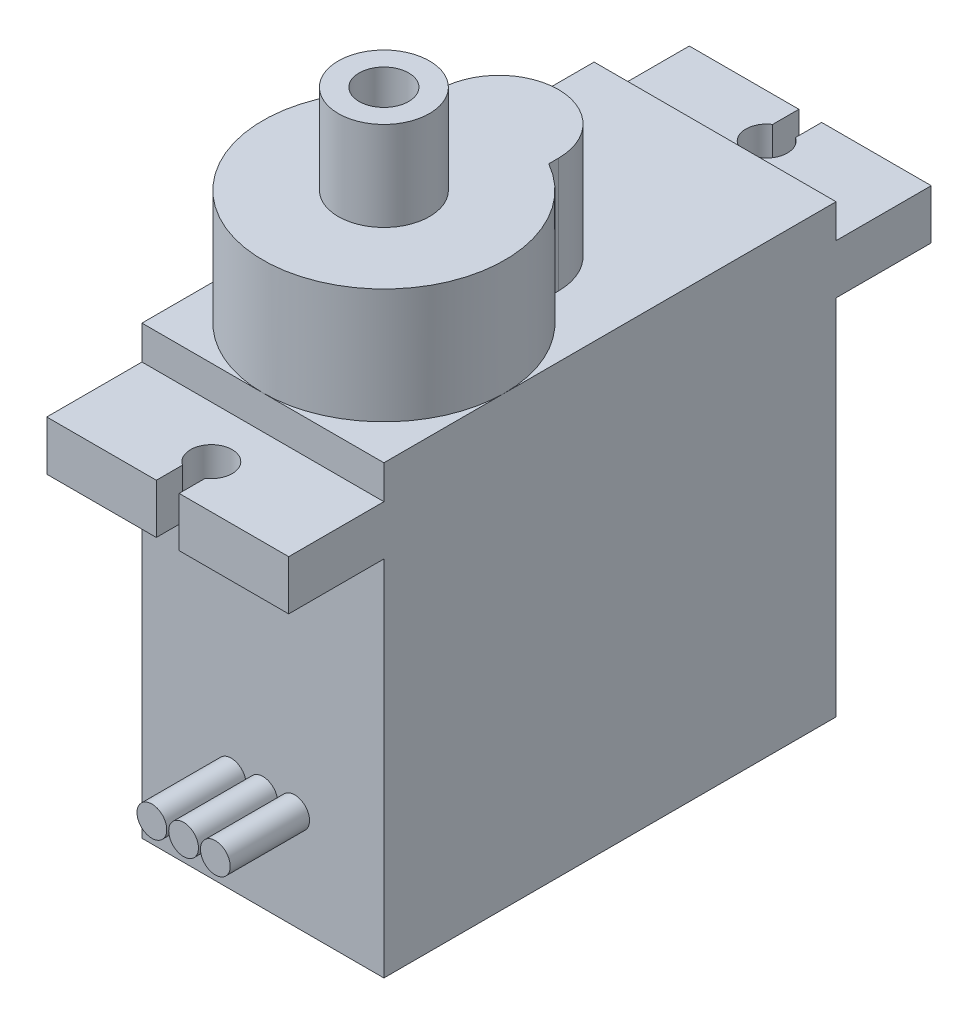
ISO-10303-21;
HEADER;
FILE_DESCRIPTION(('STEP AP214'),'2;1');
FILE_NAME('part.step','',(''),(''),'','','');
FILE_SCHEMA(('AUTOMOTIVE_DESIGN { 1 0 10303 214 1 1 1 1 }'));
ENDSEC;
DATA;
#1=APPLICATION_CONTEXT('core data for automotive mechanical design processes');
#2=APPLICATION_PROTOCOL_DEFINITION('international standard','automotive_design',2000,#1);
#3=PRODUCT_CONTEXT('',#1,'mechanical');
#4=PRODUCT('Part','Part','',(#3));
#5=PRODUCT_RELATED_PRODUCT_CATEGORY('part','',(#4));
#6=PRODUCT_DEFINITION_FORMATION('','',#4);
#7=PRODUCT_DEFINITION_CONTEXT('part definition',#1,'design');
#8=PRODUCT_DEFINITION('design','',#6,#7);
#9=PRODUCT_DEFINITION_SHAPE('','',#8);
#10=(LENGTH_UNIT() NAMED_UNIT(*) SI_UNIT(.MILLI.,.METRE.));
#11=(NAMED_UNIT(*) PLANE_ANGLE_UNIT() SI_UNIT($,.RADIAN.));
#12=(NAMED_UNIT(*) SI_UNIT($,.STERADIAN.) SOLID_ANGLE_UNIT());
#13=UNCERTAINTY_MEASURE_WITH_UNIT(LENGTH_MEASURE(1.E-05),#10,'distance_accuracy_value','');
#14=(GEOMETRIC_REPRESENTATION_CONTEXT(3) GLOBAL_UNCERTAINTY_ASSIGNED_CONTEXT((#13)) GLOBAL_UNIT_ASSIGNED_CONTEXT((#10,
#11,#12)) REPRESENTATION_CONTEXT('',''));
#15=CARTESIAN_POINT('',(0.,0.,0.));
#16=DIRECTION('',(0.,0.,1.));
#17=DIRECTION('',(1.,0.,0.));
#18=AXIS2_PLACEMENT_3D('',#15,#16,#17);
#19=CARTESIAN_POINT('',(12.2,9.55,-16.2));
#20=DIRECTION('',(0.,0.,1.));
#21=DIRECTION('',(1.,0.,0.));
#22=AXIS2_PLACEMENT_3D('',#19,#20,#21);
#23=PLANE('',#22);
#24=DIRECTION('',(-1.,0.,0.));
#25=VECTOR('',#24,1.);
#26=CARTESIAN_POINT('',(12.2,9.55,-16.2));
#27=LINE('',#26,#25);
#28=CARTESIAN_POINT('',(5.525,9.55,-16.2));
#29=VERTEX_POINT('',#28);
#30=CARTESIAN_POINT('',(0.,9.55,-16.2));
#31=VERTEX_POINT('',#30);
#32=EDGE_CURVE('E393',#29,#31,#27,.T.);
#33=ORIENTED_EDGE('',*,*,#32,.F.);
#34=DIRECTION('',(0.,1.,0.));
#35=VECTOR('',#34,1.);
#36=CARTESIAN_POINT('',(5.525,-11.25,-16.2));
#37=LINE('',#36,#35);
#38=CARTESIAN_POINT('',(5.525,7.05,-16.2));
#39=VERTEX_POINT('',#38);
#40=EDGE_CURVE('E262',#39,#29,#37,.T.);
#41=ORIENTED_EDGE('',*,*,#40,.F.);
#42=DIRECTION('',(-1.,0.,0.));
#43=VECTOR('',#42,1.);
#44=CARTESIAN_POINT('',(12.2,7.05,-16.2));
#45=LINE('',#44,#43);
#46=CARTESIAN_POINT('',(0.,7.05,-16.2));
#47=VERTEX_POINT('',#46);
#48=EDGE_CURVE('E397',#39,#47,#45,.T.);
#49=ORIENTED_EDGE('',*,*,#48,.T.);
#50=DIRECTION('',(0.,1.,0.));
#51=VECTOR('',#50,1.);
#52=CARTESIAN_POINT('',(0.,9.55,-16.2));
#53=LINE('',#52,#51);
#54=EDGE_CURVE('E346',#47,#31,#53,.T.);
#55=ORIENTED_EDGE('',*,*,#54,.T.);
#56=EDGE_LOOP('',(#33,#41,#49,#55));
#57=FACE_BOUND('',#56,.T.);
#58=ADVANCED_FACE('F37',(#57),#23,.F.);
#59=CARTESIAN_POINT('',(12.2,7.05,16.2));
#60=DIRECTION('',(0.,0.,-1.));
#61=DIRECTION('',(-1.,0.,0.));
#62=AXIS2_PLACEMENT_3D('',#59,#60,#61);
#63=PLANE('',#62);
#64=DIRECTION('',(-1.,0.,0.));
#65=VECTOR('',#64,1.);
#66=CARTESIAN_POINT('',(12.2,9.55,16.2));
#67=LINE('',#66,#65);
#68=CARTESIAN_POINT('',(12.2,9.55,16.2));
#69=VERTEX_POINT('',#68);
#70=CARTESIAN_POINT('',(6.675,9.55,16.2));
#71=VERTEX_POINT('',#70);
#72=EDGE_CURVE('E378',#69,#71,#67,.T.);
#73=ORIENTED_EDGE('',*,*,#72,.T.);
#74=DIRECTION('',(0.,1.,0.));
#75=VECTOR('',#74,1.);
#76=CARTESIAN_POINT('',(6.675,-11.25,16.2));
#77=LINE('',#76,#75);
#78=CARTESIAN_POINT('',(6.675,7.05,16.2));
#79=VERTEX_POINT('',#78);
#80=EDGE_CURVE('E250',#79,#71,#77,.T.);
#81=ORIENTED_EDGE('',*,*,#80,.F.);
#82=DIRECTION('',(-1.,0.,0.));
#83=VECTOR('',#82,1.);
#84=CARTESIAN_POINT('',(12.2,7.05,16.2));
#85=LINE('',#84,#83);
#86=CARTESIAN_POINT('',(12.2,7.05,16.2));
#87=VERTEX_POINT('',#86);
#88=EDGE_CURVE('E374',#87,#79,#85,.T.);
#89=ORIENTED_EDGE('',*,*,#88,.F.);
#90=DIRECTION('',(0.,-1.,0.));
#91=VECTOR('',#90,1.);
#92=CARTESIAN_POINT('',(12.2,7.05,16.2));
#93=LINE('',#92,#91);
#94=EDGE_CURVE('E332',#69,#87,#93,.T.);
#95=ORIENTED_EDGE('',*,*,#94,.F.);
#96=EDGE_LOOP('',(#73,#81,#89,#95));
#97=FACE_BOUND('',#96,.T.);
#98=ADVANCED_FACE('F527',(#97),#63,.F.);
#99=CARTESIAN_POINT('',(12.2,11.25,11.4));
#100=DIRECTION('',(0.,-1.,0.));
#101=DIRECTION('',(0.,0.,-1.));
#102=AXIS2_PLACEMENT_3D('',#99,#100,#101);
#103=PLANE('',#102);
#104=DIRECTION('',(0.,0.,1.));
#105=VECTOR('',#104,1.);
#106=CARTESIAN_POINT('',(3.1,11.25,-0.500000000000002));
#107=LINE('',#106,#105);
#108=CARTESIAN_POINT('',(3.1,11.25,-0.500000000000002));
#109=VERTEX_POINT('',#108);
#110=CARTESIAN_POINT('',(3.1,11.25,-0.0113086899558024));
#111=VERTEX_POINT('',#110);
#112=EDGE_CURVE('E282',#109,#111,#107,.T.);
#113=ORIENTED_EDGE('',*,*,#112,.F.);
#114=CARTESIAN_POINT('',(6.1,11.25,-0.500000000000002));
#115=DIRECTION('',(0.,1.,0.));
#116=DIRECTION('',(0.,0.,-1.));
#117=AXIS2_PLACEMENT_3D('',#114,#115,#116);
#118=CIRCLE('',#117,3.);
#119=CARTESIAN_POINT('',(9.1,11.25,-0.500000000000003));
#120=VERTEX_POINT('',#119);
#121=EDGE_CURVE('E286',#120,#109,#118,.T.);
#122=ORIENTED_EDGE('',*,*,#121,.F.);
#123=DIRECTION('',(0.,0.,-1.));
#124=VECTOR('',#123,1.);
#125=CARTESIAN_POINT('',(9.1,11.25,-0.500000000000003));
#126=LINE('',#125,#124);
#127=CARTESIAN_POINT('',(9.1,11.25,-0.0113086899557993));
#128=VERTEX_POINT('',#127);
#129=EDGE_CURVE('E277',#128,#120,#126,.T.);
#130=ORIENTED_EDGE('',*,*,#129,.F.);
#131=CARTESIAN_POINT('',(6.1,11.25,5.3));
#132=DIRECTION('',(0.,1.,0.));
#133=DIRECTION('',(0.,0.,1.));
#134=AXIS2_PLACEMENT_3D('',#131,#132,#133);
#135=CIRCLE('',#134,6.1);
#136=CARTESIAN_POINT('',(12.2,11.25,5.3));
#137=VERTEX_POINT('',#136);
#138=EDGE_CURVE('E410',#137,#128,#135,.T.);
#139=ORIENTED_EDGE('',*,*,#138,.F.);
#140=DIRECTION('',(0.,0.,1.));
#141=VECTOR('',#140,1.);
#142=CARTESIAN_POINT('',(12.2,11.25,11.4));
#143=LINE('',#142,#141);
#144=CARTESIAN_POINT('',(12.2,11.25,-11.4));
#145=VERTEX_POINT('',#144);
#146=EDGE_CURVE('E325',#145,#137,#143,.T.);
#147=ORIENTED_EDGE('',*,*,#146,.F.);
#148=DIRECTION('',(-1.,0.,0.));
#149=VECTOR('',#148,1.);
#150=CARTESIAN_POINT('',(12.2,11.25,-11.4));
#151=LINE('',#150,#149);
#152=CARTESIAN_POINT('',(0.,11.25,-11.4));
#153=VERTEX_POINT('',#152);
#154=EDGE_CURVE('E387',#145,#153,#151,.T.);
#155=ORIENTED_EDGE('',*,*,#154,.T.);
#156=DIRECTION('',(0.,0.,1.));
#157=VECTOR('',#156,1.);
#158=CARTESIAN_POINT('',(0.,11.25,11.4));
#159=LINE('',#158,#157);
#160=CARTESIAN_POINT('',(0.,11.25,5.3));
#161=VERTEX_POINT('',#160);
#162=EDGE_CURVE('E354',#153,#161,#159,.T.);
#163=ORIENTED_EDGE('',*,*,#162,.T.);
#164=EDGE_CURVE('E308',#111,#161,#135,.T.);
#165=ORIENTED_EDGE('',*,*,#164,.F.);
#166=EDGE_LOOP('',(#113,#122,#130,#139,#147,#155,#163,#165));
#167=FACE_BOUND('',#166,.T.);
#168=ADVANCED_FACE('F485',(#167),#103,.F.);
#169=CARTESIAN_POINT('',(6.1,17.05,5.3));
#170=DIRECTION('',(0.,-1.,0.));
#171=DIRECTION('',(0.,0.,-1.));
#172=AXIS2_PLACEMENT_3D('',#169,#170,#171);
#173=CYLINDRICAL_SURFACE('',#172,6.1);
#174=DIRECTION('',(0.,-1.,0.));
#175=VECTOR('',#174,1.);
#176=CARTESIAN_POINT('',(3.1,23.9905307474845,-0.0113086899558024));
#177=LINE('',#176,#175);
#178=CARTESIAN_POINT('',(3.1,17.05,-0.0113086899558024));
#179=VERTEX_POINT('',#178);
#180=EDGE_CURVE('E284',#179,#111,#177,.T.);
#181=ORIENTED_EDGE('',*,*,#180,.T.);
#182=ORIENTED_EDGE('',*,*,#164,.T.);
#183=CARTESIAN_POINT('',(6.1,11.25,11.4));
#184=VERTEX_POINT('',#183);
#185=EDGE_CURVE('E309',#161,#184,#135,.T.);
#186=ORIENTED_EDGE('',*,*,#185,.T.);
#187=EDGE_CURVE('E291',#184,#137,#135,.T.);
#188=ORIENTED_EDGE('',*,*,#187,.T.);
#189=ORIENTED_EDGE('',*,*,#138,.T.);
#190=DIRECTION('',(0.,-1.,0.));
#191=VECTOR('',#190,1.);
#192=CARTESIAN_POINT('',(9.1,23.9905307474845,-0.0113086899557993));
#193=LINE('',#192,#191);
#194=CARTESIAN_POINT('',(9.1,17.05,-0.0113086899557993));
#195=VERTEX_POINT('',#194);
#196=EDGE_CURVE('E281',#195,#128,#193,.T.);
#197=ORIENTED_EDGE('',*,*,#196,.F.);
#198=CARTESIAN_POINT('',(6.1,17.05,5.3));
#199=DIRECTION('',(0.,1.,0.));
#200=DIRECTION('',(0.,0.,1.));
#201=AXIS2_PLACEMENT_3D('',#198,#199,#200);
#202=CIRCLE('',#201,6.1);
#203=EDGE_CURVE('E302',#179,#195,#202,.T.);
#204=ORIENTED_EDGE('',*,*,#203,.F.);
#205=EDGE_LOOP('',(#181,#182,#186,#188,#189,#197,#204));
#206=FACE_BOUND('',#205,.T.);
#207=ADVANCED_FACE('F551',(#206),#173,.T.);
#208=ORIENTED_EDGE('',*,*,#187,.F.);
#209=DIRECTION('',(-1.,0.,0.));
#210=VECTOR('',#209,1.);
#211=CARTESIAN_POINT('',(12.2,11.25,11.4));
#212=LINE('',#211,#210);
#213=CARTESIAN_POINT('',(12.2,11.25,11.4));
#214=VERTEX_POINT('',#213);
#215=EDGE_CURVE('E385',#214,#184,#212,.T.);
#216=ORIENTED_EDGE('',*,*,#215,.F.);
#217=EDGE_CURVE('E324',#137,#214,#143,.T.);
#218=ORIENTED_EDGE('',*,*,#217,.F.);
#219=EDGE_LOOP('',(#208,#216,#218));
#220=FACE_BOUND('',#219,.T.);
#221=ADVANCED_FACE('F547',(#220),#103,.F.);
#222=CARTESIAN_POINT('',(12.2,-11.25,-11.4));
#223=DIRECTION('',(0.,1.,0.));
#224=DIRECTION('',(0.,0.,1.));
#225=AXIS2_PLACEMENT_3D('',#222,#223,#224);
#226=PLANE('',#225);
#227=DIRECTION('',(0.,0.,-1.));
#228=VECTOR('',#227,1.);
#229=CARTESIAN_POINT('',(0.,-11.25,-11.4));
#230=LINE('',#229,#228);
#231=CARTESIAN_POINT('',(0.,-11.25,11.4));
#232=VERTEX_POINT('',#231);
#233=CARTESIAN_POINT('',(0.,-11.25,-11.4));
#234=VERTEX_POINT('',#233);
#235=EDGE_CURVE('E305',#232,#234,#230,.T.);
#236=ORIENTED_EDGE('',*,*,#235,.T.);
#237=DIRECTION('',(-1.,0.,0.));
#238=VECTOR('',#237,1.);
#239=CARTESIAN_POINT('',(12.2,-11.25,-11.4));
#240=LINE('',#239,#238);
#241=CARTESIAN_POINT('',(12.2,-11.25,-11.4));
#242=VERTEX_POINT('',#241);
#243=EDGE_CURVE('E404',#242,#234,#240,.T.);
#244=ORIENTED_EDGE('',*,*,#243,.F.);
#245=DIRECTION('',(0.,0.,-1.));
#246=VECTOR('',#245,1.);
#247=CARTESIAN_POINT('',(12.2,-11.25,-11.4));
#248=LINE('',#247,#246);
#249=CARTESIAN_POINT('',(12.2,-11.25,11.4));
#250=VERTEX_POINT('',#249);
#251=EDGE_CURVE('E310',#250,#242,#248,.T.);
#252=ORIENTED_EDGE('',*,*,#251,.F.);
#253=DIRECTION('',(-1.,0.,0.));
#254=VECTOR('',#253,1.);
#255=CARTESIAN_POINT('',(12.2,-11.25,11.4));
#256=LINE('',#255,#254);
#257=EDGE_CURVE('E338',#250,#232,#256,.T.);
#258=ORIENTED_EDGE('',*,*,#257,.T.);
#259=EDGE_LOOP('',(#236,#244,#252,#258));
#260=FACE_BOUND('',#259,.T.);
#261=ADVANCED_FACE('F39',(#260),#226,.F.);
#262=CARTESIAN_POINT('',(12.2,7.05,-11.4));
#263=DIRECTION('',(0.,0.,1.));
#264=DIRECTION('',(1.,0.,0.));
#265=AXIS2_PLACEMENT_3D('',#262,#263,#264);
#266=PLANE('',#265);
#267=DIRECTION('',(0.,1.,0.));
#268=VECTOR('',#267,1.);
#269=CARTESIAN_POINT('',(0.,7.05,-11.4));
#270=LINE('',#269,#268);
#271=CARTESIAN_POINT('',(0.,7.05,-11.4));
#272=VERTEX_POINT('',#271);
#273=EDGE_CURVE('E341',#234,#272,#270,.T.);
#274=ORIENTED_EDGE('',*,*,#273,.T.);
#275=DIRECTION('',(-1.,0.,0.));
#276=VECTOR('',#275,1.);
#277=CARTESIAN_POINT('',(12.2,7.05,-11.4));
#278=LINE('',#277,#276);
#279=CARTESIAN_POINT('',(12.2,7.05,-11.4));
#280=VERTEX_POINT('',#279);
#281=EDGE_CURVE('E401',#280,#272,#278,.T.);
#282=ORIENTED_EDGE('',*,*,#281,.F.);
#283=DIRECTION('',(0.,1.,0.));
#284=VECTOR('',#283,1.);
#285=CARTESIAN_POINT('',(12.2,7.05,-11.4));
#286=LINE('',#285,#284);
#287=EDGE_CURVE('E313',#242,#280,#286,.T.);
#288=ORIENTED_EDGE('',*,*,#287,.F.);
#289=ORIENTED_EDGE('',*,*,#243,.T.);
#290=EDGE_LOOP('',(#274,#282,#288,#289));
#291=FACE_BOUND('',#290,.T.);
#292=ADVANCED_FACE('F451',(#291),#266,.F.);
#293=CARTESIAN_POINT('',(12.2,7.05,-16.2));
#294=DIRECTION('',(0.,1.,0.));
#295=DIRECTION('',(0.,0.,1.));
#296=AXIS2_PLACEMENT_3D('',#293,#294,#295);
#297=PLANE('',#296);
#298=ORIENTED_EDGE('',*,*,#48,.F.);
#299=DIRECTION('',(0.,0.,1.));
#300=VECTOR('',#299,1.);
#301=CARTESIAN_POINT('',(5.525,7.05,-16.2));
#302=LINE('',#301,#300);
#303=CARTESIAN_POINT('',(5.52499999999999,7.05,-14.8785641695403));
#304=VERTEX_POINT('',#303);
#305=EDGE_CURVE('E270',#39,#304,#302,.T.);
#306=ORIENTED_EDGE('',*,*,#305,.T.);
#307=CARTESIAN_POINT('',(6.1,7.05,-14.));
#308=DIRECTION('',(0.,1.,0.));
#309=DIRECTION('',(0.,0.,1.));
#310=AXIS2_PLACEMENT_3D('',#307,#308,#309);
#311=CIRCLE('',#310,1.05);
#312=CARTESIAN_POINT('',(6.67500000000001,7.05,-14.8785641695403));
#313=VERTEX_POINT('',#312);
#314=EDGE_CURVE('E273',#304,#313,#311,.T.);
#315=ORIENTED_EDGE('',*,*,#314,.T.);
#316=DIRECTION('',(0.,0.,-1.));
#317=VECTOR('',#316,1.);
#318=CARTESIAN_POINT('',(6.675,7.05,-16.2));
#319=LINE('',#318,#317);
#320=CARTESIAN_POINT('',(6.675,7.05,-16.2));
#321=VERTEX_POINT('',#320);
#322=EDGE_CURVE('E249',#313,#321,#319,.T.);
#323=ORIENTED_EDGE('',*,*,#322,.T.);
#324=CARTESIAN_POINT('',(12.2,7.05,-16.2));
#325=VERTEX_POINT('',#324);
#326=EDGE_CURVE('E398',#325,#321,#45,.T.);
#327=ORIENTED_EDGE('',*,*,#326,.F.);
#328=DIRECTION('',(0.,0.,-1.));
#329=VECTOR('',#328,1.);
#330=CARTESIAN_POINT('',(12.2,7.05,-16.2));
#331=LINE('',#330,#329);
#332=EDGE_CURVE('E316',#280,#325,#331,.T.);
#333=ORIENTED_EDGE('',*,*,#332,.F.);
#334=ORIENTED_EDGE('',*,*,#281,.T.);
#335=DIRECTION('',(0.,0.,-1.));
#336=VECTOR('',#335,1.);
#337=CARTESIAN_POINT('',(0.,7.05,-16.2));
#338=LINE('',#337,#336);
#339=EDGE_CURVE('E343',#272,#47,#338,.T.);
#340=ORIENTED_EDGE('',*,*,#339,.T.);
#341=EDGE_LOOP('',(#298,#306,#315,#323,#327,#333,#334,#340));
#342=FACE_BOUND('',#341,.T.);
#343=ADVANCED_FACE('F502',(#342),#297,.F.);
#344=ORIENTED_EDGE('',*,*,#326,.T.);
#345=DIRECTION('',(0.,1.,0.));
#346=VECTOR('',#345,1.);
#347=CARTESIAN_POINT('',(6.675,-11.25,-16.2));
#348=LINE('',#347,#346);
#349=CARTESIAN_POINT('',(6.675,9.55,-16.2));
#350=VERTEX_POINT('',#349);
#351=EDGE_CURVE('E264',#321,#350,#348,.T.);
#352=ORIENTED_EDGE('',*,*,#351,.T.);
#353=CARTESIAN_POINT('',(12.2,9.55,-16.2));
#354=VERTEX_POINT('',#353);
#355=EDGE_CURVE('E394',#354,#350,#27,.T.);
#356=ORIENTED_EDGE('',*,*,#355,.F.);
#357=DIRECTION('',(0.,1.,0.));
#358=VECTOR('',#357,1.);
#359=CARTESIAN_POINT('',(12.2,9.55,-16.2));
#360=LINE('',#359,#358);
#361=EDGE_CURVE('E318',#325,#354,#360,.T.);
#362=ORIENTED_EDGE('',*,*,#361,.F.);
#363=EDGE_LOOP('',(#344,#352,#356,#362));
#364=FACE_BOUND('',#363,.T.);
#365=ADVANCED_FACE('F507',(#364),#23,.F.);
#366=CARTESIAN_POINT('',(12.2,9.55,-11.4));
#367=DIRECTION('',(0.,-1.,0.));
#368=DIRECTION('',(0.,0.,-1.));
#369=AXIS2_PLACEMENT_3D('',#366,#367,#368);
#370=PLANE('',#369);
#371=CARTESIAN_POINT('',(6.1,9.55,-14.));
#372=DIRECTION('',(0.,1.,0.));
#373=DIRECTION('',(0.,0.,1.));
#374=AXIS2_PLACEMENT_3D('',#371,#372,#373);
#375=CIRCLE('',#374,1.05);
#376=CARTESIAN_POINT('',(5.52499999999999,9.55,-14.8785641695403));
#377=VERTEX_POINT('',#376);
#378=CARTESIAN_POINT('',(6.67500000000001,9.55,-14.8785641695403));
#379=VERTEX_POINT('',#378);
#380=EDGE_CURVE('E53',#377,#379,#375,.T.);
#381=ORIENTED_EDGE('',*,*,#380,.F.);
#382=DIRECTION('',(0.,0.,1.));
#383=VECTOR('',#382,1.);
#384=CARTESIAN_POINT('',(5.52499999999999,9.55,-14.8785641695403));
#385=LINE('',#384,#383);
#386=EDGE_CURVE('E257',#29,#377,#385,.T.);
#387=ORIENTED_EDGE('',*,*,#386,.F.);
#388=ORIENTED_EDGE('',*,*,#32,.T.);
#389=DIRECTION('',(0.,0.,1.));
#390=VECTOR('',#389,1.);
#391=CARTESIAN_POINT('',(0.,9.55,-11.4));
#392=LINE('',#391,#390);
#393=CARTESIAN_POINT('',(0.,9.55,-11.4));
#394=VERTEX_POINT('',#393);
#395=EDGE_CURVE('E349',#31,#394,#392,.T.);
#396=ORIENTED_EDGE('',*,*,#395,.T.);
#397=DIRECTION('',(-1.,0.,0.));
#398=VECTOR('',#397,1.);
#399=CARTESIAN_POINT('',(12.2,9.55,-11.4));
#400=LINE('',#399,#398);
#401=CARTESIAN_POINT('',(12.2,9.55,-11.4));
#402=VERTEX_POINT('',#401);
#403=EDGE_CURVE('E390',#402,#394,#400,.T.);
#404=ORIENTED_EDGE('',*,*,#403,.F.);
#405=DIRECTION('',(0.,0.,1.));
#406=VECTOR('',#405,1.);
#407=CARTESIAN_POINT('',(12.2,9.55,-11.4));
#408=LINE('',#407,#406);
#409=EDGE_CURVE('E320',#354,#402,#408,.T.);
#410=ORIENTED_EDGE('',*,*,#409,.F.);
#411=ORIENTED_EDGE('',*,*,#355,.T.);
#412=DIRECTION('',(0.,0.,-1.));
#413=VECTOR('',#412,1.);
#414=CARTESIAN_POINT('',(6.67500000000001,9.55,-14.8785641695403));
#415=LINE('',#414,#413);
#416=EDGE_CURVE('E255',#379,#350,#415,.T.);
#417=ORIENTED_EDGE('',*,*,#416,.F.);
#418=EDGE_LOOP('',(#381,#387,#388,#396,#404,#410,#411,#417));
#419=FACE_BOUND('',#418,.T.);
#420=ADVANCED_FACE('F494',(#419),#370,.F.);
#421=CARTESIAN_POINT('',(12.2,11.25,-11.4));
#422=DIRECTION('',(0.,0.,1.));
#423=DIRECTION('',(1.,0.,0.));
#424=AXIS2_PLACEMENT_3D('',#421,#422,#423);
#425=PLANE('',#424);
#426=DIRECTION('',(0.,1.,0.));
#427=VECTOR('',#426,1.);
#428=CARTESIAN_POINT('',(0.,11.25,-11.4));
#429=LINE('',#428,#427);
#430=EDGE_CURVE('E351',#394,#153,#429,.T.);
#431=ORIENTED_EDGE('',*,*,#430,.T.);
#432=ORIENTED_EDGE('',*,*,#154,.F.);
#433=DIRECTION('',(0.,1.,0.));
#434=VECTOR('',#433,1.);
#435=CARTESIAN_POINT('',(12.2,11.25,-11.4));
#436=LINE('',#435,#434);
#437=EDGE_CURVE('E322',#402,#145,#436,.T.);
#438=ORIENTED_EDGE('',*,*,#437,.F.);
#439=ORIENTED_EDGE('',*,*,#403,.T.);
#440=EDGE_LOOP('',(#431,#432,#438,#439));
#441=FACE_BOUND('',#440,.T.);
#442=ADVANCED_FACE('F490',(#441),#425,.F.);
#443=ORIENTED_EDGE('',*,*,#185,.F.);
#444=CARTESIAN_POINT('',(0.,11.25,11.4));
#445=VERTEX_POINT('',#444);
#446=EDGE_CURVE('E353',#161,#445,#159,.T.);
#447=ORIENTED_EDGE('',*,*,#446,.T.);
#448=EDGE_CURVE('E384',#184,#445,#212,.T.);
#449=ORIENTED_EDGE('',*,*,#448,.F.);
#450=EDGE_LOOP('',(#443,#447,#449));
#451=FACE_BOUND('',#450,.T.);
#452=ADVANCED_FACE('F554',(#451),#103,.F.);
#453=CARTESIAN_POINT('',(12.2,9.55,11.4));
#454=DIRECTION('',(0.,0.,-1.));
#455=DIRECTION('',(-1.,0.,0.));
#456=AXIS2_PLACEMENT_3D('',#453,#454,#455);
#457=PLANE('',#456);
#458=DIRECTION('',(0.,-1.,0.));
#459=VECTOR('',#458,1.);
#460=CARTESIAN_POINT('',(0.,9.55,11.4));
#461=LINE('',#460,#459);
#462=CARTESIAN_POINT('',(0.,9.55,11.4));
#463=VERTEX_POINT('',#462);
#464=EDGE_CURVE('E357',#445,#463,#461,.T.);
#465=ORIENTED_EDGE('',*,*,#464,.T.);
#466=DIRECTION('',(-1.,0.,0.));
#467=VECTOR('',#466,1.);
#468=CARTESIAN_POINT('',(12.2,9.55,11.4));
#469=LINE('',#468,#467);
#470=CARTESIAN_POINT('',(12.2,9.55,11.4));
#471=VERTEX_POINT('',#470);
#472=EDGE_CURVE('E381',#471,#463,#469,.T.);
#473=ORIENTED_EDGE('',*,*,#472,.F.);
#474=DIRECTION('',(0.,-1.,0.));
#475=VECTOR('',#474,1.);
#476=CARTESIAN_POINT('',(12.2,9.55,11.4));
#477=LINE('',#476,#475);
#478=EDGE_CURVE('E328',#214,#471,#477,.T.);
#479=ORIENTED_EDGE('',*,*,#478,.F.);
#480=ORIENTED_EDGE('',*,*,#215,.T.);
#481=ORIENTED_EDGE('',*,*,#448,.T.);
#482=EDGE_LOOP('',(#465,#473,#479,#480,#481));
#483=FACE_BOUND('',#482,.T.);
#484=ADVANCED_FACE('F474',(#483),#457,.F.);
#485=CARTESIAN_POINT('',(12.2,9.55,16.2));
#486=DIRECTION('',(0.,-1.,0.));
#487=DIRECTION('',(0.,0.,-1.));
#488=AXIS2_PLACEMENT_3D('',#485,#486,#487);
#489=PLANE('',#488);
#490=CARTESIAN_POINT('',(6.10000000000001,9.55,14.));
#491=DIRECTION('',(0.,1.,0.));
#492=DIRECTION('',(0.,0.,-1.));
#493=AXIS2_PLACEMENT_3D('',#490,#491,#492);
#494=CIRCLE('',#493,1.05);
#495=CARTESIAN_POINT('',(6.67500000000001,9.55,14.8785641695403));
#496=VERTEX_POINT('',#495);
#497=CARTESIAN_POINT('',(5.525,9.55,14.8785641695403));
#498=VERTEX_POINT('',#497);
#499=EDGE_CURVE('E237',#496,#498,#494,.T.);
#500=ORIENTED_EDGE('',*,*,#499,.F.);
#501=DIRECTION('',(0.,0.,-1.));
#502=VECTOR('',#501,1.);
#503=CARTESIAN_POINT('',(6.67500000000001,9.55,14.8785641695403));
#504=LINE('',#503,#502);
#505=EDGE_CURVE('E243',#71,#496,#504,.T.);
#506=ORIENTED_EDGE('',*,*,#505,.F.);
#507=ORIENTED_EDGE('',*,*,#72,.F.);
#508=DIRECTION('',(0.,0.,1.));
#509=VECTOR('',#508,1.);
#510=CARTESIAN_POINT('',(12.2,9.55,16.2));
#511=LINE('',#510,#509);
#512=EDGE_CURVE('E330',#471,#69,#511,.T.);
#513=ORIENTED_EDGE('',*,*,#512,.F.);
#514=ORIENTED_EDGE('',*,*,#472,.T.);
#515=DIRECTION('',(0.,0.,1.));
#516=VECTOR('',#515,1.);
#517=CARTESIAN_POINT('',(0.,9.55,16.2));
#518=LINE('',#517,#516);
#519=CARTESIAN_POINT('',(0.,9.55,16.2));
#520=VERTEX_POINT('',#519);
#521=EDGE_CURVE('E359',#463,#520,#518,.T.);
#522=ORIENTED_EDGE('',*,*,#521,.T.);
#523=CARTESIAN_POINT('',(5.525,9.55,16.2));
#524=VERTEX_POINT('',#523);
#525=EDGE_CURVE('E377',#524,#520,#67,.T.);
#526=ORIENTED_EDGE('',*,*,#525,.F.);
#527=DIRECTION('',(0.,0.,1.));
#528=VECTOR('',#527,1.);
#529=CARTESIAN_POINT('',(5.525,9.55,14.8785641695403));
#530=LINE('',#529,#528);
#531=EDGE_CURVE('E240',#498,#524,#530,.T.);
#532=ORIENTED_EDGE('',*,*,#531,.F.);
#533=EDGE_LOOP('',(#500,#506,#507,#513,#514,#522,#526,#532));
#534=FACE_BOUND('',#533,.T.);
#535=ADVANCED_FACE('F468',(#534),#489,.F.);
#536=CARTESIAN_POINT('',(5.525,7.05,16.2));
#537=VERTEX_POINT('',#536);
#538=CARTESIAN_POINT('',(0.,7.05,16.2));
#539=VERTEX_POINT('',#538);
#540=EDGE_CURVE('E373',#537,#539,#85,.T.);
#541=ORIENTED_EDGE('',*,*,#540,.F.);
#542=DIRECTION('',(0.,1.,0.));
#543=VECTOR('',#542,1.);
#544=CARTESIAN_POINT('',(5.525,-11.25,16.2));
#545=LINE('',#544,#543);
#546=EDGE_CURVE('E61',#537,#524,#545,.T.);
#547=ORIENTED_EDGE('',*,*,#546,.T.);
#548=ORIENTED_EDGE('',*,*,#525,.T.);
#549=DIRECTION('',(0.,-1.,0.));
#550=VECTOR('',#549,1.);
#551=CARTESIAN_POINT('',(0.,7.05,16.2));
#552=LINE('',#551,#550);
#553=EDGE_CURVE('E362',#520,#539,#552,.T.);
#554=ORIENTED_EDGE('',*,*,#553,.T.);
#555=EDGE_LOOP('',(#541,#547,#548,#554));
#556=FACE_BOUND('',#555,.T.);
#557=ADVANCED_FACE('F463',(#556),#63,.F.);
#558=CARTESIAN_POINT('',(12.2,7.05,11.4));
#559=DIRECTION('',(0.,1.,0.));
#560=DIRECTION('',(0.,0.,1.));
#561=AXIS2_PLACEMENT_3D('',#558,#559,#560);
#562=PLANE('',#561);
#563=ORIENTED_EDGE('',*,*,#88,.T.);
#564=DIRECTION('',(0.,0.,-1.));
#565=VECTOR('',#564,1.);
#566=CARTESIAN_POINT('',(6.67500000000004,7.05,11.4));
#567=LINE('',#566,#565);
#568=CARTESIAN_POINT('',(6.67500000000001,7.05,14.8785641695403));
#569=VERTEX_POINT('',#568);
#570=EDGE_CURVE('E413',#79,#569,#567,.T.);
#571=ORIENTED_EDGE('',*,*,#570,.T.);
#572=CARTESIAN_POINT('',(6.10000000000001,7.05,14.));
#573=DIRECTION('',(0.,1.,0.));
#574=DIRECTION('',(0.,0.,1.));
#575=AXIS2_PLACEMENT_3D('',#572,#573,#574);
#576=CIRCLE('',#575,1.05);
#577=CARTESIAN_POINT('',(5.525,7.05,14.8785641695403));
#578=VERTEX_POINT('',#577);
#579=EDGE_CURVE('E409',#569,#578,#576,.T.);
#580=ORIENTED_EDGE('',*,*,#579,.T.);
#581=DIRECTION('',(0.,0.,1.));
#582=VECTOR('',#581,1.);
#583=CARTESIAN_POINT('',(5.52500000000001,7.05,11.4));
#584=LINE('',#583,#582);
#585=EDGE_CURVE('E407',#578,#537,#584,.T.);
#586=ORIENTED_EDGE('',*,*,#585,.T.);
#587=ORIENTED_EDGE('',*,*,#540,.T.);
#588=DIRECTION('',(0.,0.,-1.));
#589=VECTOR('',#588,1.);
#590=CARTESIAN_POINT('',(0.,7.05,11.4));
#591=LINE('',#590,#589);
#592=CARTESIAN_POINT('',(0.,7.05,11.4));
#593=VERTEX_POINT('',#592);
#594=EDGE_CURVE('E365',#539,#593,#591,.T.);
#595=ORIENTED_EDGE('',*,*,#594,.T.);
#596=DIRECTION('',(-1.,0.,0.));
#597=VECTOR('',#596,1.);
#598=CARTESIAN_POINT('',(12.2,7.05,11.4));
#599=LINE('',#598,#597);
#600=CARTESIAN_POINT('',(12.2,7.05,11.4));
#601=VERTEX_POINT('',#600);
#602=EDGE_CURVE('E370',#601,#593,#599,.T.);
#603=ORIENTED_EDGE('',*,*,#602,.F.);
#604=DIRECTION('',(0.,0.,-1.));
#605=VECTOR('',#604,1.);
#606=CARTESIAN_POINT('',(12.2,7.05,11.4));
#607=LINE('',#606,#605);
#608=EDGE_CURVE('E334',#87,#601,#607,.T.);
#609=ORIENTED_EDGE('',*,*,#608,.F.);
#610=EDGE_LOOP('',(#563,#571,#580,#586,#587,#595,#603,#609));
#611=FACE_BOUND('',#610,.T.);
#612=ADVANCED_FACE('F431',(#611),#562,.F.);
#613=CARTESIAN_POINT('',(12.2,-11.25,11.4));
#614=DIRECTION('',(0.,0.,-1.));
#615=DIRECTION('',(-1.,0.,0.));
#616=AXIS2_PLACEMENT_3D('',#613,#614,#615);
#617=PLANE('',#616);
#618=CARTESIAN_POINT('',(4.5,-6.25,11.4));
#619=DIRECTION('',(0.,0.,-1.));
#620=DIRECTION('',(-1.,0.,0.));
#621=AXIS2_PLACEMENT_3D('',#618,#619,#620);
#622=CIRCLE('',#621,0.75);
#623=CARTESIAN_POINT('',(3.75,-6.25,11.4));
#624=VERTEX_POINT('',#623);
#625=EDGE_CURVE('E41',#624,#624,#622,.F.);
#626=ORIENTED_EDGE('',*,*,#625,.F.);
#627=EDGE_LOOP('',(#626));
#628=FACE_BOUND('',#627,.T.);
#629=CARTESIAN_POINT('',(7.7,-6.25,11.4));
#630=DIRECTION('',(0.,0.,-1.));
#631=DIRECTION('',(-1.,0.,0.));
#632=AXIS2_PLACEMENT_3D('',#629,#630,#631);
#633=CIRCLE('',#632,0.750000000000001);
#634=CARTESIAN_POINT('',(6.95,-6.25,11.4));
#635=VERTEX_POINT('',#634);
#636=EDGE_CURVE('E418',#635,#635,#633,.F.);
#637=ORIENTED_EDGE('',*,*,#636,.F.);
#638=EDGE_LOOP('',(#637));
#639=FACE_BOUND('',#638,.T.);
#640=CARTESIAN_POINT('',(6.1,-6.25,11.4));
#641=DIRECTION('',(0.,0.,-1.));
#642=DIRECTION('',(-1.,0.,0.));
#643=AXIS2_PLACEMENT_3D('',#640,#641,#642);
#644=CIRCLE('',#643,0.75);
#645=CARTESIAN_POINT('',(5.35,-6.25,11.4));
#646=VERTEX_POINT('',#645);
#647=EDGE_CURVE('E416',#646,#646,#644,.F.);
#648=ORIENTED_EDGE('',*,*,#647,.F.);
#649=EDGE_LOOP('',(#648));
#650=FACE_BOUND('',#649,.T.);
#651=DIRECTION('',(0.,-1.,0.));
#652=VECTOR('',#651,1.);
#653=CARTESIAN_POINT('',(0.,-11.25,11.4));
#654=LINE('',#653,#652);
#655=EDGE_CURVE('E314',#593,#232,#654,.T.);
#656=ORIENTED_EDGE('',*,*,#655,.T.);
#657=ORIENTED_EDGE('',*,*,#257,.F.);
#658=DIRECTION('',(0.,-1.,0.));
#659=VECTOR('',#658,1.);
#660=CARTESIAN_POINT('',(12.2,-11.25,11.4));
#661=LINE('',#660,#659);
#662=EDGE_CURVE('E336',#601,#250,#661,.T.);
#663=ORIENTED_EDGE('',*,*,#662,.F.);
#664=ORIENTED_EDGE('',*,*,#602,.T.);
#665=EDGE_LOOP('',(#656,#657,#663,#664));
#666=FACE_BOUND('',#665,.T.);
#667=ADVANCED_FACE('F427',(#628,#639,#650,#666),#617,.F.);
#668=CARTESIAN_POINT('',(12.2,0.,0.));
#669=DIRECTION('',(-1.,0.,0.));
#670=DIRECTION('',(0.,0.,1.));
#671=AXIS2_PLACEMENT_3D('',#668,#669,#670);
#672=PLANE('',#671);
#673=ORIENTED_EDGE('',*,*,#251,.T.);
#674=ORIENTED_EDGE('',*,*,#287,.T.);
#675=ORIENTED_EDGE('',*,*,#332,.T.);
#676=ORIENTED_EDGE('',*,*,#361,.T.);
#677=ORIENTED_EDGE('',*,*,#409,.T.);
#678=ORIENTED_EDGE('',*,*,#437,.T.);
#679=ORIENTED_EDGE('',*,*,#146,.T.);
#680=ORIENTED_EDGE('',*,*,#217,.T.);
#681=ORIENTED_EDGE('',*,*,#478,.T.);
#682=ORIENTED_EDGE('',*,*,#512,.T.);
#683=ORIENTED_EDGE('',*,*,#94,.T.);
#684=ORIENTED_EDGE('',*,*,#608,.T.);
#685=ORIENTED_EDGE('',*,*,#662,.T.);
#686=EDGE_LOOP('',(#673,#674,#675,#676,#677,#678,#679,#680,#681,#682,#683,#684,#685));
#687=FACE_BOUND('',#686,.T.);
#688=ADVANCED_FACE('F430',(#687),#672,.F.);
#689=CARTESIAN_POINT('',(0.,0.,0.));
#690=DIRECTION('',(-1.,0.,0.));
#691=DIRECTION('',(0.,0.,1.));
#692=AXIS2_PLACEMENT_3D('',#689,#690,#691);
#693=PLANE('',#692);
#694=ORIENTED_EDGE('',*,*,#235,.F.);
#695=ORIENTED_EDGE('',*,*,#655,.F.);
#696=ORIENTED_EDGE('',*,*,#594,.F.);
#697=ORIENTED_EDGE('',*,*,#553,.F.);
#698=ORIENTED_EDGE('',*,*,#521,.F.);
#699=ORIENTED_EDGE('',*,*,#464,.F.);
#700=ORIENTED_EDGE('',*,*,#446,.F.);
#701=ORIENTED_EDGE('',*,*,#162,.F.);
#702=ORIENTED_EDGE('',*,*,#430,.F.);
#703=ORIENTED_EDGE('',*,*,#395,.F.);
#704=ORIENTED_EDGE('',*,*,#54,.F.);
#705=ORIENTED_EDGE('',*,*,#339,.F.);
#706=ORIENTED_EDGE('',*,*,#273,.F.);
#707=EDGE_LOOP('',(#694,#695,#696,#697,#698,#699,#700,#701,#702,#703,#704,#705,#706));
#708=FACE_BOUND('',#707,.T.);
#709=ADVANCED_FACE('F446',(#708),#693,.T.);
#710=CARTESIAN_POINT('',(6.1,17.05,5.3));
#711=DIRECTION('',(0.,1.,0.));
#712=DIRECTION('',(0.,0.,1.));
#713=AXIS2_PLACEMENT_3D('',#710,#711,#712);
#714=PLANE('',#713);
#715=CARTESIAN_POINT('',(6.1,17.05,5.3));
#716=DIRECTION('',(0.,1.,0.));
#717=DIRECTION('',(0.,0.,1.));
#718=AXIS2_PLACEMENT_3D('',#715,#716,#717);
#719=CIRCLE('',#718,2.3);
#720=CARTESIAN_POINT('',(6.1,17.05,7.6));
#721=VERTEX_POINT('',#720);
#722=EDGE_CURVE('E11',#721,#721,#719,.T.);
#723=ORIENTED_EDGE('',*,*,#722,.F.);
#724=EDGE_LOOP('',(#723));
#725=FACE_BOUND('',#724,.T.);
#726=ORIENTED_EDGE('',*,*,#203,.T.);
#727=DIRECTION('',(0.,0.,-1.));
#728=VECTOR('',#727,1.);
#729=CARTESIAN_POINT('',(9.1,17.05,-0.500000000000003));
#730=LINE('',#729,#728);
#731=CARTESIAN_POINT('',(9.1,17.05,-0.500000000000003));
#732=VERTEX_POINT('',#731);
#733=EDGE_CURVE('E280',#195,#732,#730,.T.);
#734=ORIENTED_EDGE('',*,*,#733,.T.);
#735=CARTESIAN_POINT('',(6.1,17.05,-0.500000000000002));
#736=DIRECTION('',(0.,1.,0.));
#737=DIRECTION('',(0.,0.,1.));
#738=AXIS2_PLACEMENT_3D('',#735,#736,#737);
#739=CIRCLE('',#738,3.);
#740=CARTESIAN_POINT('',(3.1,17.05,-0.500000000000002));
#741=VERTEX_POINT('',#740);
#742=EDGE_CURVE('E292',#732,#741,#739,.T.);
#743=ORIENTED_EDGE('',*,*,#742,.T.);
#744=DIRECTION('',(0.,0.,1.));
#745=VECTOR('',#744,1.);
#746=CARTESIAN_POINT('',(3.1,17.05,-0.500000000000002));
#747=LINE('',#746,#745);
#748=EDGE_CURVE('E289',#741,#179,#747,.T.);
#749=ORIENTED_EDGE('',*,*,#748,.T.);
#750=EDGE_LOOP('',(#726,#734,#743,#749));
#751=FACE_BOUND('',#750,.T.);
#752=ADVANCED_FACE('F590',(#725,#751),#714,.T.);
#753=CARTESIAN_POINT('',(6.1,23.9905307474845,-0.500000000000002));
#754=DIRECTION('',(0.,-1.,0.));
#755=DIRECTION('',(0.,0.,-1.));
#756=AXIS2_PLACEMENT_3D('',#753,#754,#755);
#757=CYLINDRICAL_SURFACE('',#756,3.);
#758=ORIENTED_EDGE('',*,*,#742,.F.);
#759=DIRECTION('',(0.,-1.,0.));
#760=VECTOR('',#759,1.);
#761=CARTESIAN_POINT('',(9.1,23.9905307474845,-0.500000000000003));
#762=LINE('',#761,#760);
#763=EDGE_CURVE('E276',#732,#120,#762,.T.);
#764=ORIENTED_EDGE('',*,*,#763,.T.);
#765=ORIENTED_EDGE('',*,*,#121,.T.);
#766=DIRECTION('',(0.,-1.,0.));
#767=VECTOR('',#766,1.);
#768=CARTESIAN_POINT('',(3.1,23.9905307474845,-0.500000000000002));
#769=LINE('',#768,#767);
#770=EDGE_CURVE('E285',#741,#109,#769,.T.);
#771=ORIENTED_EDGE('',*,*,#770,.F.);
#772=EDGE_LOOP('',(#758,#764,#765,#771));
#773=FACE_BOUND('',#772,.T.);
#774=ADVANCED_FACE('F584',(#773),#757,.T.);
#775=CARTESIAN_POINT('',(3.1,23.9905307474845,-0.500000000000002));
#776=DIRECTION('',(1.,0.,0.));
#777=DIRECTION('',(0.,0.,-1.));
#778=AXIS2_PLACEMENT_3D('',#775,#776,#777);
#779=PLANE('',#778);
#780=ORIENTED_EDGE('',*,*,#748,.F.);
#781=ORIENTED_EDGE('',*,*,#770,.T.);
#782=ORIENTED_EDGE('',*,*,#112,.T.);
#783=ORIENTED_EDGE('',*,*,#180,.F.);
#784=EDGE_LOOP('',(#780,#781,#782,#783));
#785=FACE_BOUND('',#784,.T.);
#786=ADVANCED_FACE('F589',(#785),#779,.F.);
#787=CARTESIAN_POINT('',(9.1,23.9905307474845,-0.500000000000003));
#788=DIRECTION('',(-1.,0.,0.));
#789=DIRECTION('',(0.,0.,1.));
#790=AXIS2_PLACEMENT_3D('',#787,#788,#789);
#791=PLANE('',#790);
#792=ORIENTED_EDGE('',*,*,#733,.F.);
#793=ORIENTED_EDGE('',*,*,#196,.T.);
#794=ORIENTED_EDGE('',*,*,#129,.T.);
#795=ORIENTED_EDGE('',*,*,#763,.F.);
#796=EDGE_LOOP('',(#792,#793,#794,#795));
#797=FACE_BOUND('',#796,.T.);
#798=ADVANCED_FACE('F602',(#797),#791,.F.);
#799=CARTESIAN_POINT('',(6.10000000000001,-11.25,14.));
#800=DIRECTION('',(0.,1.,0.));
#801=DIRECTION('',(0.,0.,1.));
#802=AXIS2_PLACEMENT_3D('',#799,#800,#801);
#803=CYLINDRICAL_SURFACE('',#802,1.05);
#804=DIRECTION('',(0.,1.,0.));
#805=VECTOR('',#804,1.);
#806=CARTESIAN_POINT('',(6.67500000000001,-11.25,14.8785641695403));
#807=LINE('',#806,#805);
#808=EDGE_CURVE('E247',#569,#496,#807,.T.);
#809=ORIENTED_EDGE('',*,*,#808,.T.);
#810=ORIENTED_EDGE('',*,*,#499,.T.);
#811=DIRECTION('',(0.,1.,0.));
#812=VECTOR('',#811,1.);
#813=CARTESIAN_POINT('',(5.525,-11.25,14.8785641695403));
#814=LINE('',#813,#812);
#815=EDGE_CURVE('E246',#578,#498,#814,.T.);
#816=ORIENTED_EDGE('',*,*,#815,.F.);
#817=ORIENTED_EDGE('',*,*,#579,.F.);
#818=EDGE_LOOP('',(#809,#810,#816,#817));
#819=FACE_BOUND('',#818,.T.);
#820=ADVANCED_FACE('F611',(#819),#803,.F.);
#821=CARTESIAN_POINT('',(6.67500000000001,-11.25,14.8785641695403));
#822=DIRECTION('',(1.,0.,0.));
#823=DIRECTION('',(0.,0.,-1.));
#824=AXIS2_PLACEMENT_3D('',#821,#822,#823);
#825=PLANE('',#824);
#826=ORIENTED_EDGE('',*,*,#80,.T.);
#827=ORIENTED_EDGE('',*,*,#505,.T.);
#828=ORIENTED_EDGE('',*,*,#808,.F.);
#829=ORIENTED_EDGE('',*,*,#570,.F.);
#830=EDGE_LOOP('',(#826,#827,#828,#829));
#831=FACE_BOUND('',#830,.T.);
#832=ADVANCED_FACE('F673',(#831),#825,.F.);
#833=CARTESIAN_POINT('',(5.525,-11.25,14.8785641695403));
#834=DIRECTION('',(-1.,0.,0.));
#835=DIRECTION('',(0.,0.,1.));
#836=AXIS2_PLACEMENT_3D('',#833,#834,#835);
#837=PLANE('',#836);
#838=ORIENTED_EDGE('',*,*,#815,.T.);
#839=ORIENTED_EDGE('',*,*,#531,.T.);
#840=ORIENTED_EDGE('',*,*,#546,.F.);
#841=ORIENTED_EDGE('',*,*,#585,.F.);
#842=EDGE_LOOP('',(#838,#839,#840,#841));
#843=FACE_BOUND('',#842,.T.);
#844=ADVANCED_FACE('F523',(#843),#837,.F.);
#845=CARTESIAN_POINT('',(6.1,-11.25,-14.));
#846=DIRECTION('',(0.,1.,0.));
#847=DIRECTION('',(0.,0.,1.));
#848=AXIS2_PLACEMENT_3D('',#845,#846,#847);
#849=CYLINDRICAL_SURFACE('',#848,1.05);
#850=DIRECTION('',(0.,1.,0.));
#851=VECTOR('',#850,1.);
#852=CARTESIAN_POINT('',(5.52499999999999,-11.25,-14.8785641695403));
#853=LINE('',#852,#851);
#854=EDGE_CURVE('E241',#304,#377,#853,.T.);
#855=ORIENTED_EDGE('',*,*,#854,.T.);
#856=ORIENTED_EDGE('',*,*,#380,.T.);
#857=DIRECTION('',(0.,1.,0.));
#858=VECTOR('',#857,1.);
#859=CARTESIAN_POINT('',(6.67500000000001,-11.25,-14.8785641695403));
#860=LINE('',#859,#858);
#861=EDGE_CURVE('E260',#313,#379,#860,.T.);
#862=ORIENTED_EDGE('',*,*,#861,.F.);
#863=ORIENTED_EDGE('',*,*,#314,.F.);
#864=EDGE_LOOP('',(#855,#856,#862,#863));
#865=FACE_BOUND('',#864,.T.);
#866=ADVANCED_FACE('F511',(#865),#849,.F.);
#867=CARTESIAN_POINT('',(5.52499999999999,-11.25,-14.8785641695403));
#868=DIRECTION('',(-1.,0.,0.));
#869=DIRECTION('',(0.,0.,1.));
#870=AXIS2_PLACEMENT_3D('',#867,#868,#869);
#871=PLANE('',#870);
#872=ORIENTED_EDGE('',*,*,#40,.T.);
#873=ORIENTED_EDGE('',*,*,#386,.T.);
#874=ORIENTED_EDGE('',*,*,#854,.F.);
#875=ORIENTED_EDGE('',*,*,#305,.F.);
#876=EDGE_LOOP('',(#872,#873,#874,#875));
#877=FACE_BOUND('',#876,.T.);
#878=ADVANCED_FACE('F514',(#877),#871,.F.);
#879=CARTESIAN_POINT('',(6.67500000000001,-11.25,-14.8785641695403));
#880=DIRECTION('',(1.,0.,0.));
#881=DIRECTION('',(0.,0.,-1.));
#882=AXIS2_PLACEMENT_3D('',#879,#880,#881);
#883=PLANE('',#882);
#884=ORIENTED_EDGE('',*,*,#861,.T.);
#885=ORIENTED_EDGE('',*,*,#416,.T.);
#886=ORIENTED_EDGE('',*,*,#351,.F.);
#887=ORIENTED_EDGE('',*,*,#322,.F.);
#888=EDGE_LOOP('',(#884,#885,#886,#887));
#889=FACE_BOUND('',#888,.T.);
#890=ADVANCED_FACE('F510',(#889),#883,.F.);
#891=CARTESIAN_POINT('',(6.1,-6.25,15.4));
#892=DIRECTION('',(0.,0.,-1.));
#893=DIRECTION('',(-1.,0.,0.));
#894=AXIS2_PLACEMENT_3D('',#891,#892,#893);
#895=CYLINDRICAL_SURFACE('',#894,0.75);
#896=CARTESIAN_POINT('',(6.1,-6.25,15.4));
#897=DIRECTION('',(0.,0.,1.));
#898=DIRECTION('',(1.,0.,0.));
#899=AXIS2_PLACEMENT_3D('',#896,#897,#898);
#900=CIRCLE('',#899,0.75);
#901=CARTESIAN_POINT('',(6.85,-6.25,15.4));
#902=VERTEX_POINT('',#901);
#903=EDGE_CURVE('E234',#902,#902,#900,.T.);
#904=ORIENTED_EDGE('',*,*,#903,.F.);
#905=EDGE_LOOP('',(#904));
#906=FACE_BOUND('',#905,.T.);
#907=ORIENTED_EDGE('',*,*,#647,.T.);
#908=EDGE_LOOP('',(#907));
#909=FACE_BOUND('',#908,.T.);
#910=ADVANCED_FACE('F521',(#906,#909),#895,.T.);
#911=CARTESIAN_POINT('',(6.1,-6.25,15.4));
#912=DIRECTION('',(0.,0.,1.));
#913=DIRECTION('',(1.,0.,0.));
#914=AXIS2_PLACEMENT_3D('',#911,#912,#913);
#915=PLANE('',#914);
#916=ORIENTED_EDGE('',*,*,#903,.T.);
#917=EDGE_LOOP('',(#916));
#918=FACE_BOUND('',#917,.T.);
#919=ADVANCED_FACE('F723',(#918),#915,.T.);
#920=CARTESIAN_POINT('',(7.7,-6.25,15.4));
#921=DIRECTION('',(0.,0.,-1.));
#922=DIRECTION('',(-1.,0.,0.));
#923=AXIS2_PLACEMENT_3D('',#920,#921,#922);
#924=CYLINDRICAL_SURFACE('',#923,0.750000000000001);
#925=CARTESIAN_POINT('',(7.7,-6.25,15.4));
#926=DIRECTION('',(0.,0.,1.));
#927=DIRECTION('',(1.,0.,0.));
#928=AXIS2_PLACEMENT_3D('',#925,#926,#927);
#929=CIRCLE('',#928,0.750000000000001);
#930=CARTESIAN_POINT('',(8.45,-6.25,15.4));
#931=VERTEX_POINT('',#930);
#932=EDGE_CURVE('E231',#931,#931,#929,.T.);
#933=ORIENTED_EDGE('',*,*,#932,.F.);
#934=EDGE_LOOP('',(#933));
#935=FACE_BOUND('',#934,.T.);
#936=ORIENTED_EDGE('',*,*,#636,.T.);
#937=EDGE_LOOP('',(#936));
#938=FACE_BOUND('',#937,.T.);
#939=ADVANCED_FACE('F735',(#935,#938),#924,.T.);
#940=CARTESIAN_POINT('',(7.7,-6.25,15.4));
#941=DIRECTION('',(0.,0.,1.));
#942=DIRECTION('',(1.,0.,0.));
#943=AXIS2_PLACEMENT_3D('',#940,#941,#942);
#944=PLANE('',#943);
#945=ORIENTED_EDGE('',*,*,#932,.T.);
#946=EDGE_LOOP('',(#945));
#947=FACE_BOUND('',#946,.T.);
#948=ADVANCED_FACE('F746',(#947),#944,.T.);
#949=CARTESIAN_POINT('',(4.5,-6.25,15.4));
#950=DIRECTION('',(0.,0.,-1.));
#951=DIRECTION('',(-1.,0.,0.));
#952=AXIS2_PLACEMENT_3D('',#949,#950,#951);
#953=CYLINDRICAL_SURFACE('',#952,0.75);
#954=CARTESIAN_POINT('',(4.5,-6.25,15.4));
#955=DIRECTION('',(0.,0.,1.));
#956=DIRECTION('',(1.,0.,0.));
#957=AXIS2_PLACEMENT_3D('',#954,#955,#956);
#958=CIRCLE('',#957,0.75);
#959=CARTESIAN_POINT('',(5.25,-6.25,15.4));
#960=VERTEX_POINT('',#959);
#961=EDGE_CURVE('E224',#960,#960,#958,.T.);
#962=ORIENTED_EDGE('',*,*,#961,.F.);
#963=EDGE_LOOP('',(#962));
#964=FACE_BOUND('',#963,.T.);
#965=ORIENTED_EDGE('',*,*,#625,.T.);
#966=EDGE_LOOP('',(#965));
#967=FACE_BOUND('',#966,.T.);
#968=ADVANCED_FACE('F425',(#964,#967),#953,.T.);
#969=CARTESIAN_POINT('',(4.5,-6.25,15.4));
#970=DIRECTION('',(0.,0.,1.));
#971=DIRECTION('',(1.,0.,0.));
#972=AXIS2_PLACEMENT_3D('',#969,#970,#971);
#973=PLANE('',#972);
#974=ORIENTED_EDGE('',*,*,#961,.T.);
#975=EDGE_LOOP('',(#974));
#976=FACE_BOUND('',#975,.T.);
#977=ADVANCED_FACE('F767',(#976),#973,.T.);
#978=CARTESIAN_POINT('',(6.1,21.55,5.3));
#979=DIRECTION('',(0.,-1.,0.));
#980=DIRECTION('',(0.,0.,-1.));
#981=AXIS2_PLACEMENT_3D('',#978,#979,#980);
#982=CYLINDRICAL_SURFACE('',#981,2.3);
#983=CARTESIAN_POINT('',(6.1,21.55,5.3));
#984=DIRECTION('',(0.,1.,0.));
#985=DIRECTION('',(0.,0.,1.));
#986=AXIS2_PLACEMENT_3D('',#983,#984,#985);
#987=CIRCLE('',#986,2.3);
#988=CARTESIAN_POINT('',(6.1,21.55,7.6));
#989=VERTEX_POINT('',#988);
#990=EDGE_CURVE('E220',#989,#989,#987,.T.);
#991=ORIENTED_EDGE('',*,*,#990,.F.);
#992=EDGE_LOOP('',(#991));
#993=FACE_BOUND('',#992,.T.);
#994=ORIENTED_EDGE('',*,*,#722,.T.);
#995=EDGE_LOOP('',(#994));
#996=FACE_BOUND('',#995,.T.);
#997=ADVANCED_FACE('F777',(#993,#996),#982,.T.);
#998=CARTESIAN_POINT('',(6.1,21.55,5.3));
#999=DIRECTION('',(0.,1.,0.));
#1000=DIRECTION('',(0.,0.,1.));
#1001=AXIS2_PLACEMENT_3D('',#998,#999,#1000);
#1002=PLANE('',#1001);
#1003=CARTESIAN_POINT('',(6.1,21.55,5.3));
#1004=DIRECTION('',(0.,1.,0.));
#1005=DIRECTION('',(0.,0.,1.));
#1006=AXIS2_PLACEMENT_3D('',#1003,#1004,#1005);
#1007=CIRCLE('',#1006,1.25);
#1008=CARTESIAN_POINT('',(6.1,21.55,6.55));
#1009=VERTEX_POINT('',#1008);
#1010=EDGE_CURVE('E221',#1009,#1009,#1007,.T.);
#1011=ORIENTED_EDGE('',*,*,#1010,.F.);
#1012=EDGE_LOOP('',(#1011));
#1013=FACE_BOUND('',#1012,.T.);
#1014=ORIENTED_EDGE('',*,*,#990,.T.);
#1015=EDGE_LOOP('',(#1014));
#1016=FACE_BOUND('',#1015,.T.);
#1017=ADVANCED_FACE('F214',(#1013,#1016),#1002,.T.);
#1018=CARTESIAN_POINT('',(6.1,17.55,5.3));
#1019=DIRECTION('',(0.,1.,0.));
#1020=DIRECTION('',(0.,0.,1.));
#1021=AXIS2_PLACEMENT_3D('',#1018,#1019,#1020);
#1022=CONICAL_SURFACE('',#1021,1.25,1.02974425867665);
#1023=CARTESIAN_POINT('',(6.1,16.7989242262156,5.3));
#1024=VERTEX_POINT('',#1023);
#1025=VERTEX_LOOP('',#1024);
#1026=FACE_BOUND('',#1025,.T.);
#1027=CARTESIAN_POINT('',(6.1,17.55,5.3));
#1028=DIRECTION('',(0.,1.,0.));
#1029=DIRECTION('',(0.,0.,1.));
#1030=AXIS2_PLACEMENT_3D('',#1027,#1028,#1029);
#1031=CIRCLE('',#1030,1.25);
#1032=CARTESIAN_POINT('',(6.1,17.55,6.55));
#1033=VERTEX_POINT('',#1032);
#1034=EDGE_CURVE('E218',#1033,#1033,#1031,.T.);
#1035=ORIENTED_EDGE('',*,*,#1034,.T.);
#1036=EDGE_LOOP('',(#1035));
#1037=FACE_BOUND('',#1036,.T.);
#1038=ADVANCED_FACE('F210',(#1026,#1037),#1022,.F.);
#1039=CARTESIAN_POINT('',(6.1,21.55,5.3));
#1040=DIRECTION('',(0.,1.,0.));
#1041=DIRECTION('',(0.,0.,1.));
#1042=AXIS2_PLACEMENT_3D('',#1039,#1040,#1041);
#1043=CYLINDRICAL_SURFACE('',#1042,1.25);
#1044=ORIENTED_EDGE('',*,*,#1034,.F.);
#1045=EDGE_LOOP('',(#1044));
#1046=FACE_BOUND('',#1045,.T.);
#1047=ORIENTED_EDGE('',*,*,#1010,.T.);
#1048=EDGE_LOOP('',(#1047));
#1049=FACE_BOUND('',#1048,.T.);
#1050=ADVANCED_FACE('F213',(#1046,#1049),#1043,.F.);
#1051=CLOSED_SHELL('',(#58,#98,#168,#207,#221,#261,#292,#343,#365,#420,#442,#452,#484,#535,#557,
#612,#667,#688,#709,#752,#774,#786,#798,#820,#832,#844,#866,#878,#890,#910,#919,#939,#948,#968,
#977,#997,#1017,#1038,#1050));
#1052=MANIFOLD_SOLID_BREP('B2',#1051);
#1053=ADVANCED_BREP_SHAPE_REPRESENTATION('',(#18,#1052),#14);
#1054=SHAPE_DEFINITION_REPRESENTATION(#9,#1053);
ENDSEC;
END-ISO-10303-21;
